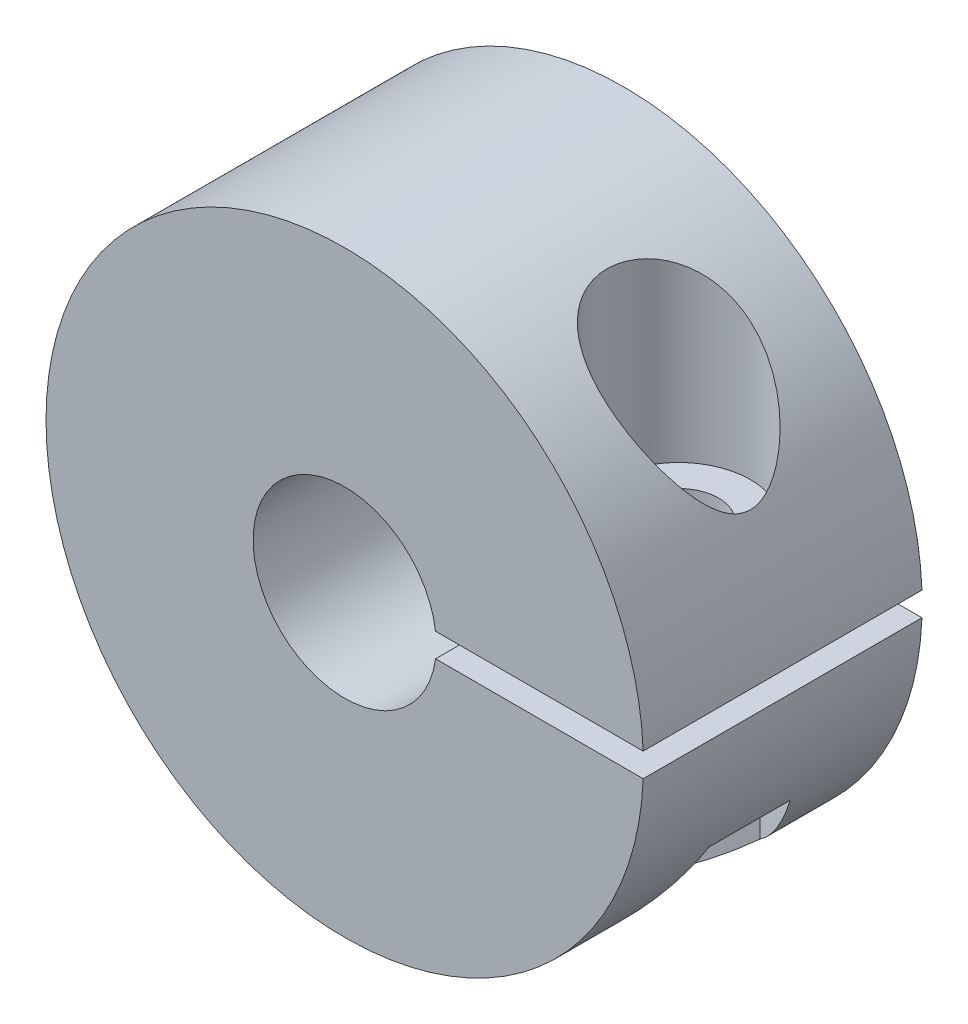
ISO-10303-21;
HEADER;
FILE_DESCRIPTION(('STEP AP214'),'2;1');
FILE_NAME('part.step','',(''),(''),'','','');
FILE_SCHEMA(('AUTOMOTIVE_DESIGN { 1 0 10303 214 1 1 1 1 }'));
ENDSEC;
DATA;
#1=APPLICATION_CONTEXT('core data for automotive mechanical design processes');
#2=APPLICATION_PROTOCOL_DEFINITION('international standard','automotive_design',2000,#1);
#3=PRODUCT_CONTEXT('',#1,'mechanical');
#4=PRODUCT('Part','Part','',(#3));
#5=PRODUCT_RELATED_PRODUCT_CATEGORY('part','',(#4));
#6=PRODUCT_DEFINITION_FORMATION('','',#4);
#7=PRODUCT_DEFINITION_CONTEXT('part definition',#1,'design');
#8=PRODUCT_DEFINITION('design','',#6,#7);
#9=PRODUCT_DEFINITION_SHAPE('','',#8);
#10=(LENGTH_UNIT() NAMED_UNIT(*) SI_UNIT(.MILLI.,.METRE.));
#11=(NAMED_UNIT(*) PLANE_ANGLE_UNIT() SI_UNIT($,.RADIAN.));
#12=(NAMED_UNIT(*) SI_UNIT($,.STERADIAN.) SOLID_ANGLE_UNIT());
#13=UNCERTAINTY_MEASURE_WITH_UNIT(LENGTH_MEASURE(1.E-05),#10,'distance_accuracy_value','');
#14=(GEOMETRIC_REPRESENTATION_CONTEXT(3) GLOBAL_UNCERTAINTY_ASSIGNED_CONTEXT((#13)) GLOBAL_UNIT_ASSIGNED_CONTEXT((#10,
#11,#12)) REPRESENTATION_CONTEXT('',''));
#15=CARTESIAN_POINT('',(0.,0.,0.));
#16=DIRECTION('',(0.,0.,1.));
#17=DIRECTION('',(1.,0.,0.));
#18=AXIS2_PLACEMENT_3D('',#15,#16,#17);
#19=CARTESIAN_POINT('',(0.,0.,14.));
#20=DIRECTION('',(0.,0.,-1.));
#21=DIRECTION('',(-1.,0.,0.));
#22=AXIS2_PLACEMENT_3D('',#19,#20,#21);
#23=CYLINDRICAL_SURFACE('',#22,15.);
#24=CARTESIAN_POINT('',(0.,0.,8.57195841844095));
#25=DIRECTION('',(-0.502263216199052,0.,-0.864714786304354));
#26=DIRECTION('',(0.864714786304354,0.,-0.502263216199052));
#27=AXIS2_PLACEMENT_3D('',#24,#25,#26);
#28=ELLIPSE('',#27,17.3467601544175,15.);
#29=CARTESIAN_POINT('',(6.21900026377973,-13.6500562533313,4.95969790954137));
#30=VERTEX_POINT('',#29);
#31=CARTESIAN_POINT('',(9.76362779775971,-11.3873426323622,2.90082710769772));
#32=VERTEX_POINT('',#31);
#33=EDGE_CURVE('E133',#30,#32,#28,.F.);
#34=ORIENTED_EDGE('',*,*,#33,.F.);
#35=CARTESIAN_POINT('',(0.,0.,-2372.95172257187));
#36=DIRECTION('',(-0.999996580067129,0.,0.00261531146267731));
#37=DIRECTION('',(-0.00261531146267731,0.,-0.999996580067129));
#38=AXIS2_PLACEMENT_3D('',#35,#36,#37);
#39=ELLIPSE('',#38,5735.45453918687,15.);
#40=CARTESIAN_POINT('',(6.22972091429637,-13.6451668120979,9.05887080184365));
#41=VERTEX_POINT('',#40);
#42=EDGE_CURVE('E113',#41,#30,#39,.F.);
#43=ORIENTED_EDGE('',*,*,#42,.F.);
#44=CARTESIAN_POINT('',(0.,0.,5.48383062438988));
#45=DIRECTION('',(-0.497733363868077,0.,0.867330097767032));
#46=DIRECTION('',(-0.867330097767032,0.,-0.497733363868077));
#47=AXIS2_PLACEMENT_3D('',#44,#45,#46);
#48=ELLIPSE('',#47,17.2944534481369,15.);
#49=CARTESIAN_POINT('',(9.785069098793,-11.3689235520275,11.0991728923023));
#50=VERTEX_POINT('',#49);
#51=EDGE_CURVE('E124',#50,#41,#48,.F.);
#52=ORIENTED_EDGE('',*,*,#51,.F.);
#53=CARTESIAN_POINT('',(0.,0.,16.7827582248652));
#54=DIRECTION('',(0.502263216199051,0.,0.864714786304354));
#55=DIRECTION('',(0.864714786304354,0.,-0.502263216199051));
#56=AXIS2_PLACEMENT_3D('',#53,#54,#55);
#57=ELLIPSE('',#56,17.3467601544175,15.);
#58=CARTESIAN_POINT('',(13.329696632773,-6.87889436452114,9.04030209045864));
#59=VERTEX_POINT('',#58);
#60=EDGE_CURVE('E48',#59,#50,#57,.F.);
#61=ORIENTED_EDGE('',*,*,#60,.F.);
#62=CARTESIAN_POINT('',(0.,0.,-5087.73353778616));
#63=DIRECTION('',(0.999996580067129,0.,-0.00261531146267773));
#64=DIRECTION('',(-0.00261531146267773,0.,-0.999996580067129));
#65=AXIS2_PLACEMENT_3D('',#62,#63,#64);
#66=ELLIPSE('',#65,5735.45453918594,15.);
#67=CARTESIAN_POINT('',(13.3189759822563,-6.89962888741696,4.94112919815636));
#68=VERTEX_POINT('',#67);
#69=EDGE_CURVE('E391',#68,#59,#66,.F.);
#70=ORIENTED_EDGE('',*,*,#69,.F.);
#71=CARTESIAN_POINT('',(0.,0.,-2.70221067439495));
#72=DIRECTION('',(0.497733363868077,0.,-0.867330097767032));
#73=DIRECTION('',(-0.867330097767032,0.,-0.497733363868077));
#74=AXIS2_PLACEMENT_3D('',#71,#72,#73);
#75=ELLIPSE('',#74,17.294453448137,15.);
#76=EDGE_CURVE('E137',#32,#68,#75,.F.);
#77=ORIENTED_EDGE('',*,*,#76,.F.);
#78=EDGE_LOOP('',(#34,#43,#52,#61,#70,#77));
#79=FACE_BOUND('',#78,.T.);
#80=CARTESIAN_POINT('',(0.,0.,0.));
#81=DIRECTION('',(0.,0.,1.));
#82=DIRECTION('',(1.,0.,0.));
#83=AXIS2_PLACEMENT_3D('',#80,#81,#82);
#84=CIRCLE('',#83,15.);
#85=CARTESIAN_POINT('',(14.9879951961562,0.6,0.));
#86=VERTEX_POINT('',#85);
#87=CARTESIAN_POINT('',(14.9879951961562,-0.6,0.));
#88=VERTEX_POINT('',#87);
#89=EDGE_CURVE('E248',#86,#88,#84,.T.);
#90=ORIENTED_EDGE('',*,*,#89,.T.);
#91=DIRECTION('',(0.,0.,-1.));
#92=VECTOR('',#91,1.);
#93=CARTESIAN_POINT('',(14.9879951961562,-0.6,14.));
#94=LINE('',#93,#92);
#95=CARTESIAN_POINT('',(14.9879951961562,-0.6,14.));
#96=VERTEX_POINT('',#95);
#97=EDGE_CURVE('E241',#88,#96,#94,.F.);
#98=ORIENTED_EDGE('',*,*,#97,.T.);
#99=CARTESIAN_POINT('',(0.,0.,14.));
#100=DIRECTION('',(0.,0.,1.));
#101=DIRECTION('',(1.,0.,0.));
#102=AXIS2_PLACEMENT_3D('',#99,#100,#101);
#103=CIRCLE('',#102,15.);
#104=CARTESIAN_POINT('',(14.9879951961562,0.6,14.));
#105=VERTEX_POINT('',#104);
#106=EDGE_CURVE('E251',#105,#96,#103,.T.);
#107=ORIENTED_EDGE('',*,*,#106,.F.);
#108=DIRECTION('',(0.,0.,-1.));
#109=VECTOR('',#108,1.);
#110=CARTESIAN_POINT('',(14.9879951961562,0.6,14.));
#111=LINE('',#110,#109);
#112=EDGE_CURVE('E238',#105,#86,#111,.T.);
#113=ORIENTED_EDGE('',*,*,#112,.T.);
#114=EDGE_LOOP('',(#90,#98,#107,#113));
#115=FACE_BOUND('',#114,.T.);
#116=CARTESIAN_POINT('',(9.77434844827635,11.3781418699047,3.4));
#117=CARTESIAN_POINT('',(10.004665721439,11.1802772044385,3.39999754786204));
#118=CARTESIAN_POINT('',(10.2290841221419,10.9752566670012,3.42208189850469));
#119=CARTESIAN_POINT('',(10.6618809332519,10.5553629491282,3.50414138097048));
#120=CARTESIAN_POINT('',(10.8702128417241,10.340463873973,3.564222063738));
#121=CARTESIAN_POINT('',(11.1877706232014,9.99323696311858,3.68663607161301));
#122=CARTESIAN_POINT('',(11.3030815202601,9.86256044746857,3.73828941394484));
#123=CARTESIAN_POINT('',(11.5268004502288,9.6001343608487,3.8528242150962));
#124=CARTESIAN_POINT('',(11.6352067822252,9.46838453441961,3.91570842619545));
#125=CARTESIAN_POINT('',(11.8447827237694,9.20486083948775,4.05229866771211));
#126=CARTESIAN_POINT('',(11.9459553357171,9.0730870039867,4.12600016911345));
#127=CARTESIAN_POINT('',(12.1408548078543,8.810580884137,4.28422987478512));
#128=CARTESIAN_POINT('',(12.2345840959852,8.6798482727739,4.36875452494973));
#129=CARTESIAN_POINT('',(12.3846265904256,8.46358054143024,4.51933184858128));
#130=CARTESIAN_POINT('',(12.4430839476787,8.37736036849902,4.58228159143354));
#131=CARTESIAN_POINT('',(12.5563509914472,8.20661541323879,4.7135229627234));
#132=CARTESIAN_POINT('',(12.6111613031267,8.12209034208563,4.78181367124236));
#133=CARTESIAN_POINT('',(12.7168775039838,7.95554786132526,4.92409654392762));
#134=CARTESIAN_POINT('',(12.7677864534599,7.87352851719196,4.99808414608807));
#135=CARTESIAN_POINT('',(12.865387835383,7.7130161892543,5.15235290795645));
#136=CARTESIAN_POINT('',(12.9120818548523,7.63452188382928,5.23263167743936));
#137=CARTESIAN_POINT('',(13.013090647959,7.46137185303739,5.42352795442596));
#138=CARTESIAN_POINT('',(13.0659241842686,7.36827628309289,5.53638228859439));
#139=CARTESIAN_POINT('',(13.1621130328565,7.19503597371881,5.77541887167154));
#140=CARTESIAN_POINT('',(13.2054839254972,7.11487000318215,5.90157869689869));
#141=CARTESIAN_POINT('',(13.2685501085029,6.99633295331523,6.1282775198459));
#142=CARTESIAN_POINT('',(13.2914421521956,6.9526451449898,6.22509494274515));
#143=CARTESIAN_POINT('',(13.3296339042077,6.87914105938174,6.42529284362718));
#144=CARTESIAN_POINT('',(13.344945448516,6.8493031617969,6.52866280412392));
#145=CARTESIAN_POINT('',(13.366634932828,6.8068849768652,6.74119972130783));
#146=CARTESIAN_POINT('',(13.3729085778189,6.79450619684668,6.85041950075122));
#147=CARTESIAN_POINT('',(13.3753419373037,6.7897160618639,7.06940752991185));
#148=CARTESIAN_POINT('',(13.3715051588049,6.79729778319051,7.17917557626823));
#149=CARTESIAN_POINT('',(13.3555545907478,6.82857097026018,7.37880922633885));
#150=CARTESIAN_POINT('',(13.3447547924993,6.84970246610319,7.4692093791524));
#151=CARTESIAN_POINT('',(13.3171155010697,6.90328529916045,7.64558397997478));
#152=CARTESIAN_POINT('',(13.300272200166,6.93574377260833,7.73155559863544));
#153=CARTESIAN_POINT('',(13.2484305140526,7.03447870923162,7.95464859261461));
#154=CARTESIAN_POINT('',(13.208852624095,7.10879135474673,8.08711181279754));
#155=CARTESIAN_POINT('',(13.1191166023118,7.27307350127589,8.338061863555));
#156=CARTESIAN_POINT('',(13.0689214898152,7.36309752948529,8.45649752502479));
#157=CARTESIAN_POINT('',(12.9645787831022,7.54518656457119,8.67198966960881));
#158=CARTESIAN_POINT('',(12.9110709797289,7.63650892254382,8.76999896896575));
#159=CARTESIAN_POINT('',(12.7979666203964,7.8245837198975,8.95695721905442));
#160=CARTESIAN_POINT('',(12.7383650912909,7.92134056492426,9.04589864927773));
#161=CARTESIAN_POINT('',(12.6135974653821,8.11854704688649,9.2158037907718));
#162=CARTESIAN_POINT('',(12.5484213880437,8.21900311571364,9.29675260965753));
#163=CARTESIAN_POINT('',(12.4129567717768,8.42219877532806,9.45118184108283));
#164=CARTESIAN_POINT('',(12.342666913947,8.52493895043354,9.52466031513804));
#165=CARTESIAN_POINT('',(12.1640508695276,8.77893586134661,9.69646582899046));
#166=CARTESIAN_POINT('',(12.052993854002,8.93095632956278,9.79084831873808));
#167=CARTESIAN_POINT('',(11.8210053904463,9.23583095186292,9.96517110526196));
#168=CARTESIAN_POINT('',(11.7000694330681,9.38868545660795,10.0451047526205));
#169=CARTESIAN_POINT('',(11.4488249331785,9.69347085895263,10.190164143193));
#170=CARTESIAN_POINT('',(11.3185248925905,9.84540246186428,10.2553031008185));
#171=CARTESIAN_POINT('',(11.0488973919314,10.1470566256321,10.3700110198609));
#172=CARTESIAN_POINT('',(10.9095735375736,10.2967800398275,10.4195861544947));
#173=CARTESIAN_POINT('',(10.6543020567462,10.5599058634951,10.4927328565825));
#174=CARTESIAN_POINT('',(10.540017749991,10.6740032150398,10.5196325367352));
#175=CARTESIAN_POINT('',(10.3067493324749,10.8994133482613,10.5623879231286));
#176=CARTESIAN_POINT('',(10.187766233242,11.0107267209198,10.5782459927936));
#177=CARTESIAN_POINT('',(9.94579782804296,11.2297678391392,10.597959859654));
#178=CARTESIAN_POINT('',(9.82281748427345,11.3374997180373,10.6018300038484));
#179=CARTESIAN_POINT('',(9.5735990910746,11.5487193671551,10.5965594480649));
#180=CARTESIAN_POINT('',(9.44736184945415,11.6522081736063,10.5874219444864));
#181=CARTESIAN_POINT('',(9.12056192414739,11.9113327835412,10.5458330096508));
#182=CARTESIAN_POINT('',(8.91830311503349,12.0633957429765,10.5031261923537));
#183=CARTESIAN_POINT('',(8.51449204040903,12.3517154222799,10.3789490728621));
#184=CARTESIAN_POINT('',(8.31293924537001,12.4879891727984,10.2975210297029));
#185=CARTESIAN_POINT('',(7.94925319177533,12.7219767899157,10.1087325032039));
#186=CARTESIAN_POINT('',(7.78582970300045,12.8223969572866,10.0072975562044));
#187=CARTESIAN_POINT('',(7.55058940039349,12.961364866258,9.83275036224947));
#188=CARTESIAN_POINT('',(7.47379416075142,13.00576039463,9.77080397093066));
#189=CARTESIAN_POINT('',(7.32435864229885,13.0904974527803,9.63958703423644));
#190=CARTESIAN_POINT('',(7.25171663400324,13.1308406753918,9.57031957223323));
#191=CARTESIAN_POINT('',(7.11106596407145,13.207543412314,9.42430686608526));
#192=CARTESIAN_POINT('',(7.04308615696635,13.2438788401383,9.34752114586577));
#193=CARTESIAN_POINT('',(6.9131397335563,13.3121705440575,9.18726308836357));
#194=CARTESIAN_POINT('',(6.85117038978039,13.3441288091919,9.10379381568086));
#195=CARTESIAN_POINT('',(6.73406408559095,13.4036076230639,8.93069697637641));
#196=CARTESIAN_POINT('',(6.67892736676774,13.431128014896,8.84106919217398));
#197=CARTESIAN_POINT('',(6.57627738413064,13.4816857921538,8.65635223126071));
#198=CARTESIAN_POINT('',(6.52876337047912,13.5047236185723,8.56126359297962));
#199=CARTESIAN_POINT('',(6.44624627941448,13.5442901542176,8.37586800484298));
#200=CARTESIAN_POINT('',(6.41047733303166,13.5612330933806,8.2859893063495));
#201=CARTESIAN_POINT('',(6.34613241114143,13.5914630496709,8.10305906398757));
#202=CARTESIAN_POINT('',(6.31755883377734,13.6047488480475,8.01000647399504));
#203=CARTESIAN_POINT('',(6.26798540096195,13.6276597194288,7.82152431192646));
#204=CARTESIAN_POINT('',(6.2469805202974,13.6372872215808,7.72609636213309));
#205=CARTESIAN_POINT('',(6.21276107694237,13.6529095406621,7.53355151643845));
#206=CARTESIAN_POINT('',(6.19954931795524,13.6589030502245,7.43643402561752));
#207=CARTESIAN_POINT('',(6.17281245985449,13.6710228860666,7.15339921401272));
#208=CARTESIAN_POINT('',(6.1696888788796,13.6724221777379,6.96616126898107));
#209=CARTESIAN_POINT('',(6.19245840562747,13.6621221683377,6.59394708591143));
#210=CARTESIAN_POINT('',(6.21834757092659,13.650424646939,6.40897054403309));
#211=CARTESIAN_POINT('',(6.29758433507995,13.6140476403954,6.04823320718183));
#212=CARTESIAN_POINT('',(6.35066080357097,13.5894962899656,5.87239995277391));
#213=CARTESIAN_POINT('',(6.48185324769602,13.5274095660475,5.53281913376103));
#214=CARTESIAN_POINT('',(6.55996939017756,13.4898741060417,5.36907164969645));
#215=CARTESIAN_POINT('',(6.73956630716201,13.4010602739491,5.05489777509745));
#216=CARTESIAN_POINT('',(6.84144360143315,13.3495459275781,4.9047654030277));
#217=CARTESIAN_POINT('',(7.06346643631626,13.2334087034059,4.62447740149995));
#218=CARTESIAN_POINT('',(7.1836140348834,13.1687843486276,4.49432402578591));
#219=CARTESIAN_POINT('',(7.44462387535429,13.0230982838189,4.2493294961563));
#220=CARTESIAN_POINT('',(7.58626925323525,12.9413188720972,4.1357535711008));
#221=CARTESIAN_POINT('',(7.87932583207399,12.7650104786994,3.93396147330932));
#222=CARTESIAN_POINT('',(8.03074239844574,12.6704744606774,3.84575938107748));
#223=CARTESIAN_POINT('',(8.35601551088515,12.458683810128,3.68566061082335));
#224=CARTESIAN_POINT('',(8.53045914657229,12.3400675395205,3.61677881782734));
#225=CARTESIAN_POINT('',(8.87981270588697,12.091109960069,3.50811112351405));
#226=CARTESIAN_POINT('',(9.05472249115973,11.9607718201649,3.46831738480452));
#227=CARTESIAN_POINT('',(9.32021471838696,11.7536125737919,3.42753379748654));
#228=CARTESIAN_POINT('',(9.41211482390127,11.6801529303038,3.41710286886607));
#229=CARTESIAN_POINT('',(9.59442260074485,11.5308689153272,3.40333843170742));
#230=CARTESIAN_POINT('',(9.68483107878465,11.4550458907133,3.40000095307199));
#231=CARTESIAN_POINT('',(9.77434844827635,11.3781418699047,3.4));
#232=B_SPLINE_CURVE_WITH_KNOTS('',3,(#116,#117,#118,#119,#120,#121,#122,#123,#124,#125,#126,
#127,#128,#129,#130,#131,#132,#133,#134,#135,#136,#137,#138,#139,#140,#141,#142,#143,#144,#145,
#146,#147,#148,#149,#150,#151,#152,#153,#154,#155,#156,#157,#158,#159,#160,#161,#162,#163,#164,
#165,#166,#167,#168,#169,#170,#171,#172,#173,#174,#175,#176,#177,#178,#179,#180,#181,#182,#183,
#184,#185,#186,#187,#188,#189,#190,#191,#192,#193,#194,#195,#196,#197,#198,#199,#200,#201,#202,
#203,#204,#205,#206,#207,#208,#209,#210,#211,#212,#213,#214,#215,#216,#217,#218,#219,#220,#221,
#222,#223,#224,#225,#226,#227,#228,#229,#230,#231),.UNSPECIFIED.,.T.,.F.,(4,2,2,2,2,2,2,2,2,2,2,
2,2,2,2,2,2,2,2,2,2,2,2,2,2,2,2,2,2,2,2,2,2,2,2,2,2,2,2,2,2,2,2,2,2,2,2,2,2,2,2,2,2,2,2,2,2,4),
(0.,0.910602534811938,1.82374583325463,2.36863076290325,2.91364940782702,3.45844051020413,
4.00305317067262,4.36803200869139,4.73294812124846,5.09757499307444,5.46206399639819,
5.92770398310549,6.39257140292904,6.71748382915424,7.0418873331646,7.37000518258444,
7.69800923259775,7.97729612743515,8.25675929749726,8.72491787737383,9.19473476535411,
9.62687449795822,10.0593697623917,10.4926562485223,10.9260548829871,11.5570491234016,
12.188333014777,12.8190508151092,13.4495181312754,13.9402447048984,14.4308662076217,
14.9209003133641,15.410814022678,16.1775265819185,16.9434042907634,17.5913249257457,
17.9155648391183,18.2396687343644,18.5656250244308,18.8914327008083,19.2172518939216,
19.5430390168592,19.8372871866839,20.1316332970182,20.4257836154689,20.7200396948783,
21.278900444964,21.8376852629514,22.3910029549353,22.9443243339322,23.5076395900904,
24.0710183447768,24.6659384578481,25.2611880712975,25.924456120249,26.5875453944416,
26.9416673524418,27.2955910614607),.UNSPECIFIED.);
#233=CARTESIAN_POINT('',(9.77434844827635,11.3781418699047,3.4));
#234=VERTEX_POINT('',#233);
#235=EDGE_CURVE('E167',#234,#234,#232,.T.);
#236=ORIENTED_EDGE('',*,*,#235,.T.);
#237=EDGE_LOOP('',(#236));
#238=FACE_BOUND('',#237,.T.);
#239=ADVANCED_FACE('F33',(#79,#115,#238),#23,.T.);
#240=CARTESIAN_POINT('',(9.77434844827635,-15.,7.));
#241=DIRECTION('',(0.,1.,0.));
#242=DIRECTION('',(0.,0.,1.));
#243=AXIS2_PLACEMENT_3D('',#240,#241,#242);
#244=CYLINDRICAL_SURFACE('',#243,2.);
#245=CARTESIAN_POINT('',(9.77434844827635,0.6,7.));
#246=DIRECTION('',(0.,1.,0.));
#247=DIRECTION('',(0.,0.,1.));
#248=AXIS2_PLACEMENT_3D('',#245,#246,#247);
#249=CIRCLE('',#248,2.);
#250=CARTESIAN_POINT('',(9.77434844827635,0.6,9.));
#251=VERTEX_POINT('',#250);
#252=EDGE_CURVE('E177',#251,#251,#249,.T.);
#253=ORIENTED_EDGE('',*,*,#252,.F.);
#254=EDGE_LOOP('',(#253));
#255=FACE_BOUND('',#254,.T.);
#256=CARTESIAN_POINT('',(9.77434844827635,4.5,7.));
#257=DIRECTION('',(0.,1.,0.));
#258=DIRECTION('',(0.,0.,1.));
#259=AXIS2_PLACEMENT_3D('',#256,#257,#258);
#260=CIRCLE('',#259,2.);
#261=CARTESIAN_POINT('',(9.77434844827635,4.5,9.));
#262=VERTEX_POINT('',#261);
#263=EDGE_CURVE('E127',#262,#262,#260,.T.);
#264=ORIENTED_EDGE('',*,*,#263,.T.);
#265=EDGE_LOOP('',(#264));
#266=FACE_BOUND('',#265,.T.);
#267=ADVANCED_FACE('F199',(#255,#266),#244,.F.);
#268=CARTESIAN_POINT('',(0.,0.,14.));
#269=DIRECTION('',(0.,0.,1.));
#270=DIRECTION('',(1.,0.,0.));
#271=AXIS2_PLACEMENT_3D('',#268,#269,#270);
#272=PLANE('',#271);
#273=DIRECTION('',(1.,0.,0.));
#274=VECTOR('',#273,1.);
#275=CARTESIAN_POINT('',(3.6,-0.6,14.));
#276=LINE('',#275,#274);
#277=CARTESIAN_POINT('',(4.56070170039655,-0.6,14.));
#278=VERTEX_POINT('',#277);
#279=EDGE_CURVE('E229',#278,#96,#276,.T.);
#280=ORIENTED_EDGE('',*,*,#279,.F.);
#281=CARTESIAN_POINT('',(0.,0.,14.));
#282=DIRECTION('',(0.,0.,1.));
#283=DIRECTION('',(1.,0.,0.));
#284=AXIS2_PLACEMENT_3D('',#281,#282,#283);
#285=CIRCLE('',#284,4.6);
#286=CARTESIAN_POINT('',(4.56070170039655,0.6,14.));
#287=VERTEX_POINT('',#286);
#288=EDGE_CURVE('E245',#287,#278,#285,.T.);
#289=ORIENTED_EDGE('',*,*,#288,.F.);
#290=DIRECTION('',(-1.,0.,0.));
#291=VECTOR('',#290,1.);
#292=CARTESIAN_POINT('',(3.6,0.6,14.));
#293=LINE('',#292,#291);
#294=EDGE_CURVE('E227',#105,#287,#293,.T.);
#295=ORIENTED_EDGE('',*,*,#294,.F.);
#296=ORIENTED_EDGE('',*,*,#106,.T.);
#297=EDGE_LOOP('',(#280,#289,#295,#296));
#298=FACE_BOUND('',#297,.T.);
#299=ADVANCED_FACE('F203',(#298),#272,.T.);
#300=CARTESIAN_POINT('',(0.,0.,0.));
#301=DIRECTION('',(0.,0.,1.));
#302=DIRECTION('',(1.,0.,0.));
#303=AXIS2_PLACEMENT_3D('',#300,#301,#302);
#304=PLANE('',#303);
#305=CARTESIAN_POINT('',(0.,0.,0.));
#306=DIRECTION('',(0.,0.,1.));
#307=DIRECTION('',(1.,0.,0.));
#308=AXIS2_PLACEMENT_3D('',#305,#306,#307);
#309=CIRCLE('',#308,4.6);
#310=CARTESIAN_POINT('',(4.56070170039655,0.6,0.));
#311=VERTEX_POINT('',#310);
#312=CARTESIAN_POINT('',(4.56070170039655,-0.6,0.));
#313=VERTEX_POINT('',#312);
#314=EDGE_CURVE('E244',#311,#313,#309,.T.);
#315=ORIENTED_EDGE('',*,*,#314,.T.);
#316=DIRECTION('',(1.,0.,0.));
#317=VECTOR('',#316,1.);
#318=CARTESIAN_POINT('',(3.6,-0.6,0.));
#319=LINE('',#318,#317);
#320=EDGE_CURVE('E55',#313,#88,#319,.T.);
#321=ORIENTED_EDGE('',*,*,#320,.T.);
#322=ORIENTED_EDGE('',*,*,#89,.F.);
#323=DIRECTION('',(-1.,0.,0.));
#324=VECTOR('',#323,1.);
#325=CARTESIAN_POINT('',(3.6,0.6,0.));
#326=LINE('',#325,#324);
#327=EDGE_CURVE('E234',#86,#311,#326,.T.);
#328=ORIENTED_EDGE('',*,*,#327,.T.);
#329=EDGE_LOOP('',(#315,#321,#322,#328));
#330=FACE_BOUND('',#329,.T.);
#331=ADVANCED_FACE('F208',(#330),#304,.F.);
#332=CARTESIAN_POINT('',(0.,0.,14.));
#333=DIRECTION('',(0.,0.,-1.));
#334=DIRECTION('',(-1.,0.,0.));
#335=AXIS2_PLACEMENT_3D('',#332,#333,#334);
#336=CYLINDRICAL_SURFACE('',#335,4.6);
#337=DIRECTION('',(0.,0.,-1.));
#338=VECTOR('',#337,1.);
#339=CARTESIAN_POINT('',(4.56070170039655,-0.6,14.));
#340=LINE('',#339,#338);
#341=EDGE_CURVE('E11',#313,#278,#340,.F.);
#342=ORIENTED_EDGE('',*,*,#341,.F.);
#343=ORIENTED_EDGE('',*,*,#314,.F.);
#344=DIRECTION('',(0.,0.,-1.));
#345=VECTOR('',#344,1.);
#346=CARTESIAN_POINT('',(4.56070170039655,0.6,14.));
#347=LINE('',#346,#345);
#348=EDGE_CURVE('E41',#287,#311,#347,.T.);
#349=ORIENTED_EDGE('',*,*,#348,.F.);
#350=ORIENTED_EDGE('',*,*,#288,.T.);
#351=EDGE_LOOP('',(#342,#343,#349,#350));
#352=FACE_BOUND('',#351,.T.);
#353=ADVANCED_FACE('F262',(#352),#336,.F.);
#354=CARTESIAN_POINT('',(3.6,0.6,0.));
#355=DIRECTION('',(0.,1.,0.));
#356=DIRECTION('',(0.,0.,1.));
#357=AXIS2_PLACEMENT_3D('',#354,#355,#356);
#358=PLANE('',#357);
#359=ORIENTED_EDGE('',*,*,#252,.T.);
#360=EDGE_LOOP('',(#359));
#361=FACE_BOUND('',#360,.T.);
#362=ORIENTED_EDGE('',*,*,#294,.T.);
#363=ORIENTED_EDGE('',*,*,#348,.T.);
#364=ORIENTED_EDGE('',*,*,#327,.F.);
#365=ORIENTED_EDGE('',*,*,#112,.F.);
#366=EDGE_LOOP('',(#362,#363,#364,#365));
#367=FACE_BOUND('',#366,.T.);
#368=ADVANCED_FACE('F220',(#361,#367),#358,.F.);
#369=CARTESIAN_POINT('',(3.6,-0.6,0.));
#370=DIRECTION('',(0.,-1.,0.));
#371=DIRECTION('',(0.,0.,-1.));
#372=AXIS2_PLACEMENT_3D('',#369,#370,#371);
#373=PLANE('',#372);
#374=CARTESIAN_POINT('',(9.77434844827635,-0.6,7.));
#375=DIRECTION('',(0.,-1.,0.));
#376=DIRECTION('',(0.,0.,-1.));
#377=AXIS2_PLACEMENT_3D('',#374,#375,#376);
#378=CIRCLE('',#377,2.);
#379=CARTESIAN_POINT('',(9.77434844827635,-0.6,5.));
#380=VERTEX_POINT('',#379);
#381=EDGE_CURVE('E36',#380,#380,#378,.T.);
#382=ORIENTED_EDGE('',*,*,#381,.T.);
#383=EDGE_LOOP('',(#382));
#384=FACE_BOUND('',#383,.T.);
#385=ORIENTED_EDGE('',*,*,#320,.F.);
#386=ORIENTED_EDGE('',*,*,#341,.T.);
#387=ORIENTED_EDGE('',*,*,#279,.T.);
#388=ORIENTED_EDGE('',*,*,#97,.F.);
#389=EDGE_LOOP('',(#385,#386,#387,#388));
#390=FACE_BOUND('',#389,.T.);
#391=ADVANCED_FACE('F215',(#384,#390),#373,.F.);
#392=CARTESIAN_POINT('',(9.77434844827635,-4.5,7.));
#393=DIRECTION('',(0.,1.,0.));
#394=DIRECTION('',(0.,0.,1.));
#395=AXIS2_PLACEMENT_3D('',#392,#393,#394);
#396=CIRCLE('',#395,2.);
#397=CARTESIAN_POINT('',(9.77434844827635,-4.5,9.));
#398=VERTEX_POINT('',#397);
#399=EDGE_CURVE('E128',#398,#398,#396,.T.);
#400=ORIENTED_EDGE('',*,*,#399,.F.);
#401=EDGE_LOOP('',(#400));
#402=FACE_BOUND('',#401,.T.);
#403=ORIENTED_EDGE('',*,*,#381,.F.);
#404=EDGE_LOOP('',(#403));
#405=FACE_BOUND('',#404,.T.);
#406=ADVANCED_FACE('F194',(#402,#405),#244,.F.);
#407=CARTESIAN_POINT('',(9.77434844827635,15.001,7.));
#408=DIRECTION('',(0.,-1.,0.));
#409=DIRECTION('',(0.,0.,-1.));
#410=AXIS2_PLACEMENT_3D('',#407,#408,#409);
#411=CYLINDRICAL_SURFACE('',#410,3.6);
#412=CARTESIAN_POINT('',(9.77434844827635,4.5,7.));
#413=DIRECTION('',(0.,1.,0.));
#414=DIRECTION('',(0.,0.,1.));
#415=AXIS2_PLACEMENT_3D('',#412,#413,#414);
#416=CIRCLE('',#415,3.6);
#417=CARTESIAN_POINT('',(9.77434844827635,4.5,10.6));
#418=VERTEX_POINT('',#417);
#419=EDGE_CURVE('E164',#418,#418,#416,.T.);
#420=ORIENTED_EDGE('',*,*,#419,.F.);
#421=EDGE_LOOP('',(#420));
#422=FACE_BOUND('',#421,.T.);
#423=ORIENTED_EDGE('',*,*,#235,.F.);
#424=EDGE_LOOP('',(#423));
#425=FACE_BOUND('',#424,.T.);
#426=ADVANCED_FACE('F179',(#422,#425),#411,.F.);
#427=CARTESIAN_POINT('',(9.77434844827635,4.5,7.));
#428=DIRECTION('',(0.,1.,0.));
#429=DIRECTION('',(0.,0.,1.));
#430=AXIS2_PLACEMENT_3D('',#427,#428,#429);
#431=PLANE('',#430);
#432=ORIENTED_EDGE('',*,*,#263,.F.);
#433=EDGE_LOOP('',(#432));
#434=FACE_BOUND('',#433,.T.);
#435=ORIENTED_EDGE('',*,*,#419,.T.);
#436=EDGE_LOOP('',(#435));
#437=FACE_BOUND('',#436,.T.);
#438=ADVANCED_FACE('F186',(#434,#437),#431,.T.);
#439=CARTESIAN_POINT('',(6.21900026377973,-15.001,4.95969790954137));
#440=DIRECTION('',(-0.999996580067129,0.,0.00261531146267731));
#441=DIRECTION('',(0.00261531146267731,0.,0.999996580067129));
#442=AXIS2_PLACEMENT_3D('',#439,#440,#441);
#443=PLANE('',#442);
#444=ORIENTED_EDGE('',*,*,#42,.T.);
#445=DIRECTION('',(0.,1.,0.));
#446=VECTOR('',#445,1.);
#447=CARTESIAN_POINT('',(6.21900026377973,-15.001,4.95969790954137));
#448=LINE('',#447,#446);
#449=CARTESIAN_POINT('',(6.21900026377973,-4.5,4.95969790954137));
#450=VERTEX_POINT('',#449);
#451=EDGE_CURVE('E153',#30,#450,#448,.T.);
#452=ORIENTED_EDGE('',*,*,#451,.T.);
#453=DIRECTION('',(0.00261531146267731,0.,0.999996580067129));
#454=VECTOR('',#453,1.);
#455=CARTESIAN_POINT('',(6.21900026377973,-4.5,4.95969790954137));
#456=LINE('',#455,#454);
#457=CARTESIAN_POINT('',(6.22972091429637,-4.5,9.05887080184365));
#458=VERTEX_POINT('',#457);
#459=EDGE_CURVE('E116',#450,#458,#456,.T.);
#460=ORIENTED_EDGE('',*,*,#459,.T.);
#461=DIRECTION('',(0.,1.,0.));
#462=VECTOR('',#461,1.);
#463=CARTESIAN_POINT('',(6.22972091429637,-15.001,9.05887080184365));
#464=LINE('',#463,#462);
#465=EDGE_CURVE('E109',#41,#458,#464,.T.);
#466=ORIENTED_EDGE('',*,*,#465,.F.);
#467=EDGE_LOOP('',(#444,#452,#460,#466));
#468=FACE_BOUND('',#467,.T.);
#469=ADVANCED_FACE('F111',(#468),#443,.F.);
#470=CARTESIAN_POINT('',(9.76362779775971,-15.001,2.90082710769772));
#471=DIRECTION('',(-0.502263216199052,0.,-0.864714786304354));
#472=DIRECTION('',(-0.864714786304354,0.,0.502263216199052));
#473=AXIS2_PLACEMENT_3D('',#470,#471,#472);
#474=PLANE('',#473);
#475=ORIENTED_EDGE('',*,*,#33,.T.);
#476=DIRECTION('',(0.,1.,0.));
#477=VECTOR('',#476,1.);
#478=CARTESIAN_POINT('',(9.76362779775971,-15.001,2.90082710769772));
#479=LINE('',#478,#477);
#480=CARTESIAN_POINT('',(9.76362779775971,-4.5,2.90082710769772));
#481=VERTEX_POINT('',#480);
#482=EDGE_CURVE('E155',#32,#481,#479,.T.);
#483=ORIENTED_EDGE('',*,*,#482,.T.);
#484=DIRECTION('',(-0.864714786304354,0.,0.502263216199052));
#485=VECTOR('',#484,1.);
#486=CARTESIAN_POINT('',(9.76362779775971,-4.5,2.90082710769772));
#487=LINE('',#486,#485);
#488=EDGE_CURVE('E121',#481,#450,#487,.T.);
#489=ORIENTED_EDGE('',*,*,#488,.T.);
#490=ORIENTED_EDGE('',*,*,#451,.F.);
#491=EDGE_LOOP('',(#475,#483,#489,#490));
#492=FACE_BOUND('',#491,.T.);
#493=ADVANCED_FACE('F193',(#492),#474,.F.);
#494=CARTESIAN_POINT('',(13.3189759822563,-15.001,4.94112919815636));
#495=DIRECTION('',(0.497733363868077,0.,-0.867330097767032));
#496=DIRECTION('',(-0.867330097767032,0.,-0.497733363868077));
#497=AXIS2_PLACEMENT_3D('',#494,#495,#496);
#498=PLANE('',#497);
#499=ORIENTED_EDGE('',*,*,#76,.T.);
#500=DIRECTION('',(0.,1.,0.));
#501=VECTOR('',#500,1.);
#502=CARTESIAN_POINT('',(13.3189759822563,-15.001,4.94112919815636));
#503=LINE('',#502,#501);
#504=CARTESIAN_POINT('',(13.3189759822563,-4.5,4.94112919815636));
#505=VERTEX_POINT('',#504);
#506=EDGE_CURVE('E157',#68,#505,#503,.T.);
#507=ORIENTED_EDGE('',*,*,#506,.T.);
#508=DIRECTION('',(-0.867330097767031,0.,-0.497733363868077));
#509=VECTOR('',#508,1.);
#510=CARTESIAN_POINT('',(13.3189759822563,-4.5,4.94112919815636));
#511=LINE('',#510,#509);
#512=EDGE_CURVE('E148',#505,#481,#511,.T.);
#513=ORIENTED_EDGE('',*,*,#512,.T.);
#514=ORIENTED_EDGE('',*,*,#482,.F.);
#515=EDGE_LOOP('',(#499,#507,#513,#514));
#516=FACE_BOUND('',#515,.T.);
#517=ADVANCED_FACE('F333',(#516),#498,.F.);
#518=CARTESIAN_POINT('',(13.329696632773,-15.001,9.04030209045864));
#519=DIRECTION('',(0.999996580067129,0.,-0.00261531146267773));
#520=DIRECTION('',(-0.00261531146267773,0.,-0.999996580067129));
#521=AXIS2_PLACEMENT_3D('',#518,#519,#520);
#522=PLANE('',#521);
#523=ORIENTED_EDGE('',*,*,#69,.T.);
#524=DIRECTION('',(0.,1.,0.));
#525=VECTOR('',#524,1.);
#526=CARTESIAN_POINT('',(13.329696632773,-15.001,9.04030209045864));
#527=LINE('',#526,#525);
#528=CARTESIAN_POINT('',(13.329696632773,-4.5,9.04030209045864));
#529=VERTEX_POINT('',#528);
#530=EDGE_CURVE('E159',#59,#529,#527,.T.);
#531=ORIENTED_EDGE('',*,*,#530,.T.);
#532=DIRECTION('',(-0.00261531146267773,0.,-0.999996580067129));
#533=VECTOR('',#532,1.);
#534=CARTESIAN_POINT('',(13.329696632773,-4.5,9.04030209045864));
#535=LINE('',#534,#533);
#536=EDGE_CURVE('E145',#529,#505,#535,.T.);
#537=ORIENTED_EDGE('',*,*,#536,.T.);
#538=ORIENTED_EDGE('',*,*,#506,.F.);
#539=EDGE_LOOP('',(#523,#531,#537,#538));
#540=FACE_BOUND('',#539,.T.);
#541=ADVANCED_FACE('F342',(#540),#522,.F.);
#542=CARTESIAN_POINT('',(9.785069098793,-15.001,11.0991728923023));
#543=DIRECTION('',(0.502263216199051,0.,0.864714786304354));
#544=DIRECTION('',(0.864714786304354,0.,-0.502263216199051));
#545=AXIS2_PLACEMENT_3D('',#542,#543,#544);
#546=PLANE('',#545);
#547=ORIENTED_EDGE('',*,*,#60,.T.);
#548=DIRECTION('',(0.,1.,0.));
#549=VECTOR('',#548,1.);
#550=CARTESIAN_POINT('',(9.785069098793,-15.001,11.0991728923023));
#551=LINE('',#550,#549);
#552=CARTESIAN_POINT('',(9.785069098793,-4.5,11.0991728923023));
#553=VERTEX_POINT('',#552);
#554=EDGE_CURVE('E120',#50,#553,#551,.T.);
#555=ORIENTED_EDGE('',*,*,#554,.T.);
#556=DIRECTION('',(0.864714786304354,0.,-0.502263216199051));
#557=VECTOR('',#556,1.);
#558=CARTESIAN_POINT('',(9.785069098793,-4.5,11.0991728923023));
#559=LINE('',#558,#557);
#560=EDGE_CURVE('E142',#553,#529,#559,.T.);
#561=ORIENTED_EDGE('',*,*,#560,.T.);
#562=ORIENTED_EDGE('',*,*,#530,.F.);
#563=EDGE_LOOP('',(#547,#555,#561,#562));
#564=FACE_BOUND('',#563,.T.);
#565=ADVANCED_FACE('F351',(#564),#546,.F.);
#566=CARTESIAN_POINT('',(6.22972091429637,-15.001,9.05887080184365));
#567=DIRECTION('',(-0.497733363868077,0.,0.867330097767032));
#568=DIRECTION('',(0.867330097767032,0.,0.497733363868077));
#569=AXIS2_PLACEMENT_3D('',#566,#567,#568);
#570=PLANE('',#569);
#571=ORIENTED_EDGE('',*,*,#51,.T.);
#572=ORIENTED_EDGE('',*,*,#465,.T.);
#573=DIRECTION('',(0.867330097767032,0.,0.497733363868077));
#574=VECTOR('',#573,1.);
#575=CARTESIAN_POINT('',(6.22972091429637,-4.5,9.05887080184365));
#576=LINE('',#575,#574);
#577=EDGE_CURVE('E135',#458,#553,#576,.T.);
#578=ORIENTED_EDGE('',*,*,#577,.T.);
#579=ORIENTED_EDGE('',*,*,#554,.F.);
#580=EDGE_LOOP('',(#571,#572,#578,#579));
#581=FACE_BOUND('',#580,.T.);
#582=ADVANCED_FACE('F125',(#581),#570,.F.);
#583=CARTESIAN_POINT('',(0.,-4.5,0.));
#584=DIRECTION('',(0.,1.,0.));
#585=DIRECTION('',(0.,0.,1.));
#586=AXIS2_PLACEMENT_3D('',#583,#584,#585);
#587=PLANE('',#586);
#588=ORIENTED_EDGE('',*,*,#399,.T.);
#589=EDGE_LOOP('',(#588));
#590=FACE_BOUND('',#589,.T.);
#591=ORIENTED_EDGE('',*,*,#459,.F.);
#592=ORIENTED_EDGE('',*,*,#488,.F.);
#593=ORIENTED_EDGE('',*,*,#512,.F.);
#594=ORIENTED_EDGE('',*,*,#536,.F.);
#595=ORIENTED_EDGE('',*,*,#560,.F.);
#596=ORIENTED_EDGE('',*,*,#577,.F.);
#597=EDGE_LOOP('',(#591,#592,#593,#594,#595,#596));
#598=FACE_BOUND('',#597,.T.);
#599=ADVANCED_FACE('F367',(#590,#598),#587,.F.);
#600=CLOSED_SHELL('',(#239,#267,#299,#331,#353,#368,#391,#406,#426,#438,#469,#493,#517,#541,
#565,#582,#599));
#601=MANIFOLD_SOLID_BREP('B2',#600);
#602=ADVANCED_BREP_SHAPE_REPRESENTATION('',(#18,#601),#14);
#603=SHAPE_DEFINITION_REPRESENTATION(#9,#602);
ENDSEC;
END-ISO-10303-21;
